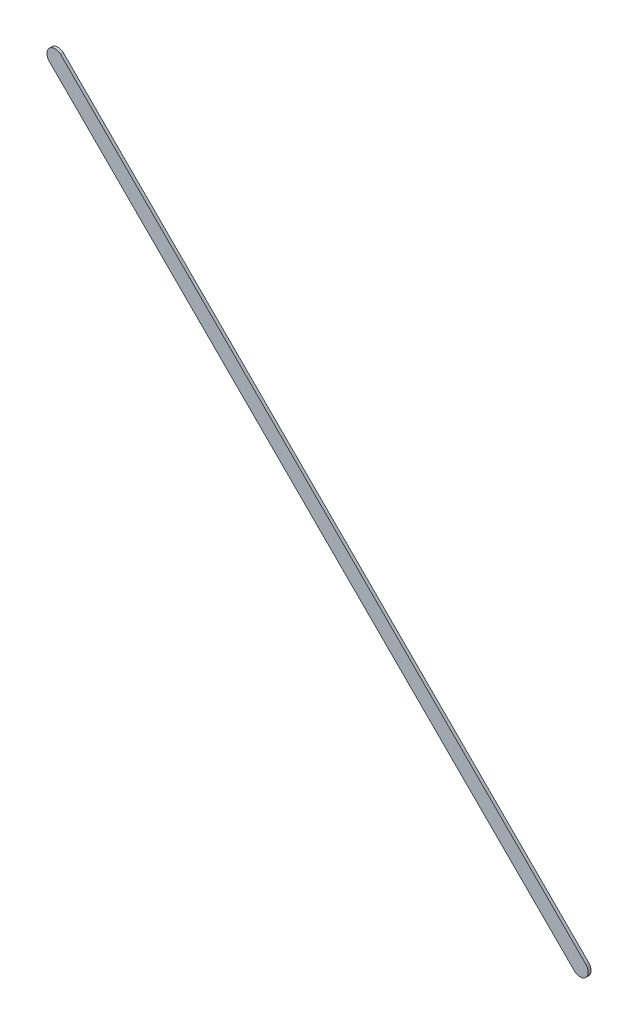
ISO-10303-21;
HEADER;
FILE_DESCRIPTION(('STEP AP214'),'2;1');
FILE_NAME('part.step','',(''),(''),'','','');
FILE_SCHEMA(('AUTOMOTIVE_DESIGN { 1 0 10303 214 1 1 1 1 }'));
ENDSEC;
DATA;
#1=APPLICATION_CONTEXT('core data for automotive mechanical design processes');
#2=APPLICATION_PROTOCOL_DEFINITION('international standard','automotive_design',2000,#1);
#3=PRODUCT_CONTEXT('',#1,'mechanical');
#4=PRODUCT('Part','Part','',(#3));
#5=PRODUCT_RELATED_PRODUCT_CATEGORY('part','',(#4));
#6=PRODUCT_DEFINITION_FORMATION('','',#4);
#7=PRODUCT_DEFINITION_CONTEXT('part definition',#1,'design');
#8=PRODUCT_DEFINITION('design','',#6,#7);
#9=PRODUCT_DEFINITION_SHAPE('','',#8);
#10=(LENGTH_UNIT() NAMED_UNIT(*) SI_UNIT(.MILLI.,.METRE.));
#11=(NAMED_UNIT(*) PLANE_ANGLE_UNIT() SI_UNIT($,.RADIAN.));
#12=(NAMED_UNIT(*) SI_UNIT($,.STERADIAN.) SOLID_ANGLE_UNIT());
#13=UNCERTAINTY_MEASURE_WITH_UNIT(LENGTH_MEASURE(1.E-05),#10,'distance_accuracy_value','');
#14=(GEOMETRIC_REPRESENTATION_CONTEXT(3) GLOBAL_UNCERTAINTY_ASSIGNED_CONTEXT((#13)) GLOBAL_UNIT_ASSIGNED_CONTEXT((#10,
#11,#12)) REPRESENTATION_CONTEXT('',''));
#15=CARTESIAN_POINT('',(0.,0.,0.));
#16=DIRECTION('',(0.,0.,1.));
#17=DIRECTION('',(1.,0.,0.));
#18=AXIS2_PLACEMENT_3D('',#15,#16,#17);
#19=CARTESIAN_POINT('',(83.879289,-118.514338,1.635));
#20=DIRECTION('',(0.,0.,1.));
#21=DIRECTION('',(1.,0.,0.));
#22=AXIS2_PLACEMENT_3D('',#19,#20,#21);
#23=PLANE('',#22);
#24=DIRECTION('',(0.707106781186548,-0.707106781186548,0.));
#25=VECTOR('',#24,1.);
#26=CARTESIAN_POINT('',(83.879289,-118.514338,1.635));
#27=LINE('',#26,#25);
#28=CARTESIAN_POINT('',(83.879289,-118.514338,1.635));
#29=VERTEX_POINT('',#28);
#30=CARTESIAN_POINT('',(90.326473,-124.961522,1.635));
#31=VERTEX_POINT('',#30);
#32=EDGE_CURVE('E96',#29,#31,#27,.T.);
#33=ORIENTED_EDGE('',*,*,#32,.T.);
#34=CARTESIAN_POINT('',(90.3971835,-124.8908115,1.635));
#35=DIRECTION('',(0.,0.,1.));
#36=DIRECTION('',(-0.707106781186548,-0.707106781186548,0.));
#37=AXIS2_PLACEMENT_3D('',#34,#35,#36);
#38=CIRCLE('',#37,0.09999974810219);
#39=CARTESIAN_POINT('',(90.467894,-124.820101,1.635));
#40=VERTEX_POINT('',#39);
#41=EDGE_CURVE('E75',#31,#40,#38,.T.);
#42=ORIENTED_EDGE('',*,*,#41,.T.);
#43=DIRECTION('',(-0.707106781186548,0.707106781186548,0.));
#44=VECTOR('',#43,1.);
#45=CARTESIAN_POINT('',(90.467894,-124.820101,1.635));
#46=LINE('',#45,#44);
#47=CARTESIAN_POINT('',(84.02071,-118.372917,1.635));
#48=VERTEX_POINT('',#47);
#49=EDGE_CURVE('E80',#40,#48,#46,.T.);
#50=ORIENTED_EDGE('',*,*,#49,.T.);
#51=CARTESIAN_POINT('',(83.9499995,-118.4436275,1.635));
#52=DIRECTION('',(0.,0.,1.));
#53=DIRECTION('',(0.707106781187048,0.707106781186048,0.));
#54=AXIS2_PLACEMENT_3D('',#51,#52,#53);
#55=CIRCLE('',#54,0.09999974810218);
#56=EDGE_CURVE('E11',#48,#29,#55,.T.);
#57=ORIENTED_EDGE('',*,*,#56,.T.);
#58=EDGE_LOOP('',(#33,#42,#50,#57));
#59=FACE_BOUND('',#58,.T.);
#60=ADVANCED_FACE('F17',(#59),#23,.T.);
#61=CARTESIAN_POINT('',(83.879289,-118.514338,1.6));
#62=DIRECTION('',(0.,0.,1.));
#63=DIRECTION('',(1.,0.,0.));
#64=AXIS2_PLACEMENT_3D('',#61,#62,#63);
#65=PLANE('',#64);
#66=CARTESIAN_POINT('',(83.9499995,-118.4436275,1.6));
#67=DIRECTION('',(0.,0.,1.));
#68=DIRECTION('',(0.707106781187048,0.707106781186048,0.));
#69=AXIS2_PLACEMENT_3D('',#66,#67,#68);
#70=CIRCLE('',#69,0.09999974810218);
#71=CARTESIAN_POINT('',(84.02071,-118.372917,1.6));
#72=VERTEX_POINT('',#71);
#73=CARTESIAN_POINT('',(83.879289,-118.514338,1.6));
#74=VERTEX_POINT('',#73);
#75=EDGE_CURVE('E25',#72,#74,#70,.T.);
#76=ORIENTED_EDGE('',*,*,#75,.F.);
#77=DIRECTION('',(-0.707106781186548,0.707106781186548,0.));
#78=VECTOR('',#77,1.);
#79=CARTESIAN_POINT('',(90.467894,-124.820101,1.6));
#80=LINE('',#79,#78);
#81=CARTESIAN_POINT('',(90.467894,-124.820101,1.6));
#82=VERTEX_POINT('',#81);
#83=EDGE_CURVE('E65',#82,#72,#80,.T.);
#84=ORIENTED_EDGE('',*,*,#83,.F.);
#85=CARTESIAN_POINT('',(90.3971835,-124.8908115,1.6));
#86=DIRECTION('',(0.,0.,1.));
#87=DIRECTION('',(-0.707106781186548,-0.707106781186548,0.));
#88=AXIS2_PLACEMENT_3D('',#85,#86,#87);
#89=CIRCLE('',#88,0.09999974810219);
#90=CARTESIAN_POINT('',(90.326473,-124.961522,1.6));
#91=VERTEX_POINT('',#90);
#92=EDGE_CURVE('E69',#91,#82,#89,.T.);
#93=ORIENTED_EDGE('',*,*,#92,.F.);
#94=DIRECTION('',(0.707106781186548,-0.707106781186548,0.));
#95=VECTOR('',#94,1.);
#96=CARTESIAN_POINT('',(83.879289,-118.514338,1.6));
#97=LINE('',#96,#95);
#98=EDGE_CURVE('E115',#74,#91,#97,.T.);
#99=ORIENTED_EDGE('',*,*,#98,.F.);
#100=EDGE_LOOP('',(#76,#84,#93,#99));
#101=FACE_BOUND('',#100,.T.);
#102=ADVANCED_FACE('F67',(#101),#65,.F.);
#103=CARTESIAN_POINT('',(83.9499995,-118.4436275,1.6));
#104=DIRECTION('',(0.,0.,-1.));
#105=DIRECTION('',(0.707106781187048,0.707106781186048,0.));
#106=AXIS2_PLACEMENT_3D('',#103,#104,#105);
#107=CYLINDRICAL_SURFACE('',#106,0.09999974810218);
#108=ORIENTED_EDGE('',*,*,#75,.T.);
#109=DIRECTION('',(0.,0.,1.));
#110=VECTOR('',#109,1.);
#111=CARTESIAN_POINT('',(83.879289,-118.514338,1.6));
#112=LINE('',#111,#110);
#113=EDGE_CURVE('E90',#74,#29,#112,.T.);
#114=ORIENTED_EDGE('',*,*,#113,.T.);
#115=ORIENTED_EDGE('',*,*,#56,.F.);
#116=DIRECTION('',(0.,0.,1.));
#117=VECTOR('',#116,1.);
#118=CARTESIAN_POINT('',(84.02071,-118.372917,1.6));
#119=LINE('',#118,#117);
#120=EDGE_CURVE('E74',#72,#48,#119,.T.);
#121=ORIENTED_EDGE('',*,*,#120,.F.);
#122=EDGE_LOOP('',(#108,#114,#115,#121));
#123=FACE_BOUND('',#122,.T.);
#124=ADVANCED_FACE('F110',(#123),#107,.T.);
#125=CARTESIAN_POINT('',(90.467894,-124.820101,1.6));
#126=DIRECTION('',(-0.707106781186548,-0.707106781186548,0.));
#127=DIRECTION('',(-0.707106781186548,0.707106781186548,0.));
#128=AXIS2_PLACEMENT_3D('',#125,#126,#127);
#129=PLANE('',#128);
#130=ORIENTED_EDGE('',*,*,#83,.T.);
#131=ORIENTED_EDGE('',*,*,#120,.T.);
#132=ORIENTED_EDGE('',*,*,#49,.F.);
#133=DIRECTION('',(0.,0.,1.));
#134=VECTOR('',#133,1.);
#135=CARTESIAN_POINT('',(90.467894,-124.820101,1.6));
#136=LINE('',#135,#134);
#137=EDGE_CURVE('E78',#82,#40,#136,.T.);
#138=ORIENTED_EDGE('',*,*,#137,.F.);
#139=EDGE_LOOP('',(#130,#131,#132,#138));
#140=FACE_BOUND('',#139,.T.);
#141=ADVANCED_FACE('F79',(#140),#129,.F.);
#142=CARTESIAN_POINT('',(90.3971835,-124.8908115,1.6));
#143=DIRECTION('',(0.,0.,-1.));
#144=DIRECTION('',(-0.707106781186548,-0.707106781186548,0.));
#145=AXIS2_PLACEMENT_3D('',#142,#143,#144);
#146=CYLINDRICAL_SURFACE('',#145,0.09999974810219);
#147=ORIENTED_EDGE('',*,*,#92,.T.);
#148=ORIENTED_EDGE('',*,*,#137,.T.);
#149=ORIENTED_EDGE('',*,*,#41,.F.);
#150=DIRECTION('',(0.,0.,1.));
#151=VECTOR('',#150,1.);
#152=CARTESIAN_POINT('',(90.326473,-124.961522,1.6));
#153=LINE('',#152,#151);
#154=EDGE_CURVE('E87',#91,#31,#153,.T.);
#155=ORIENTED_EDGE('',*,*,#154,.F.);
#156=EDGE_LOOP('',(#147,#148,#149,#155));
#157=FACE_BOUND('',#156,.T.);
#158=ADVANCED_FACE('F85',(#157),#146,.T.);
#159=CARTESIAN_POINT('',(83.879289,-118.514338,1.6));
#160=DIRECTION('',(0.707106781186548,0.707106781186548,0.));
#161=DIRECTION('',(0.,0.,-1.));
#162=AXIS2_PLACEMENT_3D('',#159,#160,#161);
#163=PLANE('',#162);
#164=ORIENTED_EDGE('',*,*,#98,.T.);
#165=ORIENTED_EDGE('',*,*,#154,.T.);
#166=ORIENTED_EDGE('',*,*,#32,.F.);
#167=ORIENTED_EDGE('',*,*,#113,.F.);
#168=EDGE_LOOP('',(#164,#165,#166,#167));
#169=FACE_BOUND('',#168,.T.);
#170=ADVANCED_FACE('F114',(#169),#163,.F.);
#171=CLOSED_SHELL('',(#60,#102,#124,#141,#158,#170));
#172=MANIFOLD_SOLID_BREP('B1',#171);
#173=ADVANCED_BREP_SHAPE_REPRESENTATION('',(#18,#172),#14);
#174=SHAPE_DEFINITION_REPRESENTATION(#9,#173);
ENDSEC;
END-ISO-10303-21;
